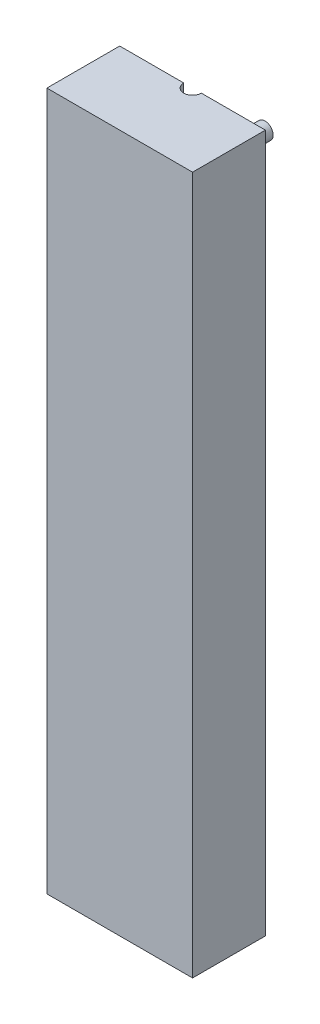
ISO-10303-21;
HEADER;
FILE_DESCRIPTION(('STEP AP214'),'2;1');
FILE_NAME('part.step','',(''),(''),'','','');
FILE_SCHEMA(('AUTOMOTIVE_DESIGN { 1 0 10303 214 1 1 1 1 }'));
ENDSEC;
DATA;
#1=APPLICATION_CONTEXT('core data for automotive mechanical design processes');
#2=APPLICATION_PROTOCOL_DEFINITION('international standard','automotive_design',2000,#1);
#3=PRODUCT_CONTEXT('',#1,'mechanical');
#4=PRODUCT('Part','Part','',(#3));
#5=PRODUCT_RELATED_PRODUCT_CATEGORY('part','',(#4));
#6=PRODUCT_DEFINITION_FORMATION('','',#4);
#7=PRODUCT_DEFINITION_CONTEXT('part definition',#1,'design');
#8=PRODUCT_DEFINITION('design','',#6,#7);
#9=PRODUCT_DEFINITION_SHAPE('','',#8);
#10=(LENGTH_UNIT() NAMED_UNIT(*) SI_UNIT(.MILLI.,.METRE.));
#11=(NAMED_UNIT(*) PLANE_ANGLE_UNIT() SI_UNIT($,.RADIAN.));
#12=(NAMED_UNIT(*) SI_UNIT($,.STERADIAN.) SOLID_ANGLE_UNIT());
#13=UNCERTAINTY_MEASURE_WITH_UNIT(LENGTH_MEASURE(1.E-05),#10,'distance_accuracy_value','');
#14=(GEOMETRIC_REPRESENTATION_CONTEXT(3) GLOBAL_UNCERTAINTY_ASSIGNED_CONTEXT((#13)) GLOBAL_UNIT_ASSIGNED_CONTEXT((#10,
#11,#12)) REPRESENTATION_CONTEXT('',''));
#15=CARTESIAN_POINT('',(0.,0.,0.));
#16=DIRECTION('',(0.,0.,1.));
#17=DIRECTION('',(1.,0.,0.));
#18=AXIS2_PLACEMENT_3D('',#15,#16,#17);
#19=CARTESIAN_POINT('',(0.,0.,0.));
#20=DIRECTION('',(0.,1.,0.));
#21=DIRECTION('',(0.,0.,1.));
#22=AXIS2_PLACEMENT_3D('',#19,#20,#21);
#23=CYLINDRICAL_SURFACE('',#22,12.5);
#24=CARTESIAN_POINT('',(0.,123.,0.));
#25=DIRECTION('',(0.,-1.,0.));
#26=DIRECTION('',(0.,0.,-1.));
#27=AXIS2_PLACEMENT_3D('',#24,#25,#26);
#28=CIRCLE('',#27,12.5);
#29=CARTESIAN_POINT('',(12.5,123.,0.));
#30=VERTEX_POINT('',#29);
#31=CARTESIAN_POINT('',(-12.5,123.,0.));
#32=VERTEX_POINT('',#31);
#33=EDGE_CURVE('E187',#30,#32,#28,.T.);
#34=ORIENTED_EDGE('',*,*,#33,.T.);
#35=DIRECTION('',(0.,-1.,0.));
#36=VECTOR('',#35,1.);
#37=CARTESIAN_POINT('',(-12.5,150.5,0.));
#38=LINE('',#37,#36);
#39=CARTESIAN_POINT('',(-12.5,142.5,0.));
#40=VERTEX_POINT('',#39);
#41=EDGE_CURVE('E56',#32,#40,#38,.F.);
#42=ORIENTED_EDGE('',*,*,#41,.T.);
#43=CARTESIAN_POINT('',(0.,142.5,0.));
#44=DIRECTION('',(0.,1.,0.));
#45=DIRECTION('',(0.,0.,1.));
#46=AXIS2_PLACEMENT_3D('',#43,#44,#45);
#47=CIRCLE('',#46,12.5);
#48=CARTESIAN_POINT('',(12.5,142.5,0.));
#49=VERTEX_POINT('',#48);
#50=EDGE_CURVE('E67',#40,#49,#47,.T.);
#51=ORIENTED_EDGE('',*,*,#50,.T.);
#52=DIRECTION('',(0.,-1.,0.));
#53=VECTOR('',#52,1.);
#54=CARTESIAN_POINT('',(12.5,150.5,0.));
#55=LINE('',#54,#53);
#56=EDGE_CURVE('E11',#49,#30,#55,.T.);
#57=ORIENTED_EDGE('',*,*,#56,.T.);
#58=EDGE_LOOP('',(#34,#42,#51,#57));
#59=FACE_BOUND('',#58,.T.);
#60=ADVANCED_FACE('F47',(#59),#23,.F.);
#61=CARTESIAN_POINT('',(0.,150.5,0.));
#62=DIRECTION('',(0.,1.,0.));
#63=DIRECTION('',(0.,0.,1.));
#64=AXIS2_PLACEMENT_3D('',#61,#62,#63);
#65=PLANE('',#64);
#66=DIRECTION('',(-1.,0.,0.));
#67=VECTOR('',#66,1.);
#68=CARTESIAN_POINT('',(-13.5,150.5,0.));
#69=LINE('',#68,#67);
#70=CARTESIAN_POINT('',(15.5,150.5,0.));
#71=VERTEX_POINT('',#70);
#72=CARTESIAN_POINT('',(1.875,150.5,0.));
#73=VERTEX_POINT('',#72);
#74=EDGE_CURVE('E138',#71,#73,#69,.T.);
#75=ORIENTED_EDGE('',*,*,#74,.T.);
#76=CARTESIAN_POINT('',(0.,150.5,0.));
#77=DIRECTION('',(0.,-1.,0.));
#78=DIRECTION('',(0.,0.,1.));
#79=AXIS2_PLACEMENT_3D('',#76,#77,#78);
#80=CIRCLE('',#79,1.875);
#81=CARTESIAN_POINT('',(-1.875,150.5,0.));
#82=VERTEX_POINT('',#81);
#83=EDGE_CURVE('E207',#73,#82,#80,.T.);
#84=ORIENTED_EDGE('',*,*,#83,.T.);
#85=CARTESIAN_POINT('',(-15.5,150.5,0.));
#86=VERTEX_POINT('',#85);
#87=EDGE_CURVE('E232',#82,#86,#69,.T.);
#88=ORIENTED_EDGE('',*,*,#87,.T.);
#89=DIRECTION('',(0.,0.,1.));
#90=VECTOR('',#89,1.);
#91=CARTESIAN_POINT('',(-15.5,150.5,0.));
#92=LINE('',#91,#90);
#93=CARTESIAN_POINT('',(-15.5,150.5,15.5));
#94=VERTEX_POINT('',#93);
#95=EDGE_CURVE('E145',#86,#94,#92,.T.);
#96=ORIENTED_EDGE('',*,*,#95,.T.);
#97=DIRECTION('',(1.,0.,0.));
#98=VECTOR('',#97,1.);
#99=CARTESIAN_POINT('',(-15.5,150.5,15.5));
#100=LINE('',#99,#98);
#101=CARTESIAN_POINT('',(15.5,150.5,15.5));
#102=VERTEX_POINT('',#101);
#103=EDGE_CURVE('E162',#94,#102,#100,.T.);
#104=ORIENTED_EDGE('',*,*,#103,.T.);
#105=DIRECTION('',(0.,0.,-1.));
#106=VECTOR('',#105,1.);
#107=CARTESIAN_POINT('',(15.5,150.5,15.5));
#108=LINE('',#107,#106);
#109=EDGE_CURVE('E156',#102,#71,#108,.T.);
#110=ORIENTED_EDGE('',*,*,#109,.T.);
#111=EDGE_LOOP('',(#75,#84,#88,#96,#104,#110));
#112=FACE_BOUND('',#111,.T.);
#113=ADVANCED_FACE('F49',(#112),#65,.T.);
#114=CARTESIAN_POINT('',(-13.5,2.,0.));
#115=DIRECTION('',(0.,0.,-1.));
#116=DIRECTION('',(-1.,0.,0.));
#117=AXIS2_PLACEMENT_3D('',#114,#115,#116);
#118=PLANE('',#117);
#119=CARTESIAN_POINT('',(12.,5.5,0.));
#120=DIRECTION('',(0.,0.,-1.));
#121=DIRECTION('',(-1.,0.,0.));
#122=AXIS2_PLACEMENT_3D('',#119,#120,#121);
#123=CIRCLE('',#122,1.75);
#124=CARTESIAN_POINT('',(10.25,5.5,0.));
#125=VERTEX_POINT('',#124);
#126=EDGE_CURVE('E291',#125,#125,#123,.T.);
#127=ORIENTED_EDGE('',*,*,#126,.F.);
#128=EDGE_LOOP('',(#127));
#129=FACE_BOUND('',#128,.T.);
#130=CARTESIAN_POINT('',(12.,147.,0.));
#131=DIRECTION('',(0.,0.,-1.));
#132=DIRECTION('',(-1.,0.,0.));
#133=AXIS2_PLACEMENT_3D('',#130,#131,#132);
#134=CIRCLE('',#133,1.75);
#135=CARTESIAN_POINT('',(10.25,147.,0.));
#136=VERTEX_POINT('',#135);
#137=EDGE_CURVE('E294',#136,#136,#134,.T.);
#138=ORIENTED_EDGE('',*,*,#137,.F.);
#139=EDGE_LOOP('',(#138));
#140=FACE_BOUND('',#139,.T.);
#141=ORIENTED_EDGE('',*,*,#56,.F.);
#142=DIRECTION('',(-1.,0.,0.));
#143=VECTOR('',#142,1.);
#144=CARTESIAN_POINT('',(12.5,142.5,0.));
#145=LINE('',#144,#143);
#146=CARTESIAN_POINT('',(1.875,142.5,0.));
#147=VERTEX_POINT('',#146);
#148=EDGE_CURVE('E212',#49,#147,#145,.T.);
#149=ORIENTED_EDGE('',*,*,#148,.T.);
#150=DIRECTION('',(0.,1.,0.));
#151=VECTOR('',#150,1.);
#152=CARTESIAN_POINT('',(1.875,142.5,0.));
#153=LINE('',#152,#151);
#154=EDGE_CURVE('E224',#147,#73,#153,.T.);
#155=ORIENTED_EDGE('',*,*,#154,.T.);
#156=ORIENTED_EDGE('',*,*,#74,.F.);
#157=DIRECTION('',(0.,1.,0.));
#158=VECTOR('',#157,1.);
#159=CARTESIAN_POINT('',(15.5,2.,0.));
#160=LINE('',#159,#158);
#161=CARTESIAN_POINT('',(15.5,2.,0.));
#162=VERTEX_POINT('',#161);
#163=EDGE_CURVE('E177',#162,#71,#160,.T.);
#164=ORIENTED_EDGE('',*,*,#163,.F.);
#165=DIRECTION('',(-1.,0.,0.));
#166=VECTOR('',#165,1.);
#167=CARTESIAN_POINT('',(-13.5,2.,0.));
#168=LINE('',#167,#166);
#169=CARTESIAN_POINT('',(8.,2.,0.));
#170=VERTEX_POINT('',#169);
#171=EDGE_CURVE('E137',#162,#170,#168,.T.);
#172=ORIENTED_EDGE('',*,*,#171,.T.);
#173=DIRECTION('',(0.,-1.,0.));
#174=VECTOR('',#173,1.);
#175=CARTESIAN_POINT('',(8.,123.,0.));
#176=LINE('',#175,#174);
#177=CARTESIAN_POINT('',(8.,123.,0.));
#178=VERTEX_POINT('',#177);
#179=EDGE_CURVE('E203',#178,#170,#176,.T.);
#180=ORIENTED_EDGE('',*,*,#179,.F.);
#181=DIRECTION('',(1.,0.,0.));
#182=VECTOR('',#181,1.);
#183=CARTESIAN_POINT('',(8.,123.,0.));
#184=LINE('',#183,#182);
#185=EDGE_CURVE('E197',#178,#30,#184,.T.);
#186=ORIENTED_EDGE('',*,*,#185,.T.);
#187=EDGE_LOOP('',(#141,#149,#155,#156,#164,#172,#180,#186));
#188=FACE_BOUND('',#187,.T.);
#189=ADVANCED_FACE('F254',(#129,#140,#188),#118,.T.);
#190=CARTESIAN_POINT('',(-12.,5.5,0.));
#191=DIRECTION('',(0.,0.,-1.));
#192=DIRECTION('',(-1.,0.,0.));
#193=AXIS2_PLACEMENT_3D('',#190,#191,#192);
#194=CIRCLE('',#193,1.75);
#195=CARTESIAN_POINT('',(-13.75,5.5,0.));
#196=VERTEX_POINT('',#195);
#197=EDGE_CURVE('E354',#196,#196,#194,.T.);
#198=ORIENTED_EDGE('',*,*,#197,.F.);
#199=EDGE_LOOP('',(#198));
#200=FACE_BOUND('',#199,.T.);
#201=CARTESIAN_POINT('',(-12.,147.,0.));
#202=DIRECTION('',(0.,0.,-1.));
#203=DIRECTION('',(-1.,0.,0.));
#204=AXIS2_PLACEMENT_3D('',#201,#202,#203);
#205=CIRCLE('',#204,1.75);
#206=CARTESIAN_POINT('',(-13.75,147.,0.));
#207=VERTEX_POINT('',#206);
#208=EDGE_CURVE('E165',#207,#207,#205,.T.);
#209=ORIENTED_EDGE('',*,*,#208,.F.);
#210=EDGE_LOOP('',(#209));
#211=FACE_BOUND('',#210,.T.);
#212=ORIENTED_EDGE('',*,*,#41,.F.);
#213=DIRECTION('',(1.,0.,0.));
#214=VECTOR('',#213,1.);
#215=CARTESIAN_POINT('',(-12.5,123.,0.));
#216=LINE('',#215,#214);
#217=CARTESIAN_POINT('',(-8.,123.,0.));
#218=VERTEX_POINT('',#217);
#219=EDGE_CURVE('E190',#32,#218,#216,.T.);
#220=ORIENTED_EDGE('',*,*,#219,.T.);
#221=DIRECTION('',(0.,-1.,0.));
#222=VECTOR('',#221,1.);
#223=CARTESIAN_POINT('',(-8.,123.,0.));
#224=LINE('',#223,#222);
#225=CARTESIAN_POINT('',(-8.,2.,0.));
#226=VERTEX_POINT('',#225);
#227=EDGE_CURVE('E131',#218,#226,#224,.T.);
#228=ORIENTED_EDGE('',*,*,#227,.T.);
#229=CARTESIAN_POINT('',(-15.5,2.,0.));
#230=VERTEX_POINT('',#229);
#231=EDGE_CURVE('E125',#226,#230,#168,.T.);
#232=ORIENTED_EDGE('',*,*,#231,.T.);
#233=DIRECTION('',(0.,1.,0.));
#234=VECTOR('',#233,1.);
#235=CARTESIAN_POINT('',(-15.5,2.,0.));
#236=LINE('',#235,#234);
#237=EDGE_CURVE('E128',#230,#86,#236,.T.);
#238=ORIENTED_EDGE('',*,*,#237,.T.);
#239=ORIENTED_EDGE('',*,*,#87,.F.);
#240=DIRECTION('',(0.,1.,0.));
#241=VECTOR('',#240,1.);
#242=CARTESIAN_POINT('',(-1.875,142.5,0.));
#243=LINE('',#242,#241);
#244=CARTESIAN_POINT('',(-1.875,142.5,0.));
#245=VERTEX_POINT('',#244);
#246=EDGE_CURVE('E228',#245,#82,#243,.T.);
#247=ORIENTED_EDGE('',*,*,#246,.F.);
#248=DIRECTION('',(-1.,0.,0.));
#249=VECTOR('',#248,1.);
#250=CARTESIAN_POINT('',(-1.875,142.5,0.));
#251=LINE('',#250,#249);
#252=EDGE_CURVE('E220',#245,#40,#251,.T.);
#253=ORIENTED_EDGE('',*,*,#252,.T.);
#254=EDGE_LOOP('',(#212,#220,#228,#232,#238,#239,#247,#253));
#255=FACE_BOUND('',#254,.T.);
#256=ADVANCED_FACE('F127',(#200,#211,#255),#118,.T.);
#257=CARTESIAN_POINT('',(0.,2.,0.));
#258=DIRECTION('',(0.,1.,0.));
#259=DIRECTION('',(0.,0.,1.));
#260=AXIS2_PLACEMENT_3D('',#257,#258,#259);
#261=PLANE('',#260);
#262=ORIENTED_EDGE('',*,*,#231,.F.);
#263=CARTESIAN_POINT('',(0.,2.,0.));
#264=DIRECTION('',(0.,1.,0.));
#265=DIRECTION('',(0.,0.,-1.));
#266=AXIS2_PLACEMENT_3D('',#263,#264,#265);
#267=CIRCLE('',#266,8.);
#268=EDGE_CURVE('E181',#226,#170,#267,.T.);
#269=ORIENTED_EDGE('',*,*,#268,.T.);
#270=ORIENTED_EDGE('',*,*,#171,.F.);
#271=DIRECTION('',(0.,0.,-1.));
#272=VECTOR('',#271,1.);
#273=CARTESIAN_POINT('',(15.5,2.,15.5));
#274=LINE('',#273,#272);
#275=CARTESIAN_POINT('',(15.5,2.,15.5));
#276=VERTEX_POINT('',#275);
#277=EDGE_CURVE('E148',#276,#162,#274,.T.);
#278=ORIENTED_EDGE('',*,*,#277,.F.);
#279=DIRECTION('',(1.,0.,0.));
#280=VECTOR('',#279,1.);
#281=CARTESIAN_POINT('',(-15.5,2.,15.5));
#282=LINE('',#281,#280);
#283=CARTESIAN_POINT('',(-15.5,2.,15.5));
#284=VERTEX_POINT('',#283);
#285=EDGE_CURVE('E154',#284,#276,#282,.T.);
#286=ORIENTED_EDGE('',*,*,#285,.F.);
#287=DIRECTION('',(0.,0.,1.));
#288=VECTOR('',#287,1.);
#289=CARTESIAN_POINT('',(-15.5,2.,0.));
#290=LINE('',#289,#288);
#291=EDGE_CURVE('E143',#230,#284,#290,.T.);
#292=ORIENTED_EDGE('',*,*,#291,.F.);
#293=EDGE_LOOP('',(#262,#269,#270,#278,#286,#292));
#294=FACE_BOUND('',#293,.T.);
#295=ADVANCED_FACE('F151',(#294),#261,.F.);
#296=CARTESIAN_POINT('',(0.,142.5,0.));
#297=DIRECTION('',(0.,1.,0.));
#298=DIRECTION('',(0.,0.,1.));
#299=AXIS2_PLACEMENT_3D('',#296,#297,#298);
#300=CYLINDRICAL_SURFACE('',#299,1.875);
#301=ORIENTED_EDGE('',*,*,#83,.F.);
#302=ORIENTED_EDGE('',*,*,#154,.F.);
#303=CARTESIAN_POINT('',(0.,142.5,0.));
#304=DIRECTION('',(0.,-1.,0.));
#305=DIRECTION('',(0.,0.,1.));
#306=AXIS2_PLACEMENT_3D('',#303,#304,#305);
#307=CIRCLE('',#306,1.875);
#308=EDGE_CURVE('E216',#147,#245,#307,.T.);
#309=ORIENTED_EDGE('',*,*,#308,.T.);
#310=ORIENTED_EDGE('',*,*,#246,.T.);
#311=EDGE_LOOP('',(#301,#302,#309,#310));
#312=FACE_BOUND('',#311,.T.);
#313=ADVANCED_FACE('F243',(#312),#300,.F.);
#314=CARTESIAN_POINT('',(0.,142.5,0.));
#315=DIRECTION('',(0.,1.,0.));
#316=DIRECTION('',(0.,0.,1.));
#317=AXIS2_PLACEMENT_3D('',#314,#315,#316);
#318=PLANE('',#317);
#319=ORIENTED_EDGE('',*,*,#50,.F.);
#320=ORIENTED_EDGE('',*,*,#252,.F.);
#321=ORIENTED_EDGE('',*,*,#308,.F.);
#322=ORIENTED_EDGE('',*,*,#148,.F.);
#323=EDGE_LOOP('',(#319,#320,#321,#322));
#324=FACE_BOUND('',#323,.T.);
#325=ADVANCED_FACE('F248',(#324),#318,.F.);
#326=CARTESIAN_POINT('',(0.,123.,0.));
#327=DIRECTION('',(0.,-1.,0.));
#328=DIRECTION('',(0.,0.,-1.));
#329=AXIS2_PLACEMENT_3D('',#326,#327,#328);
#330=CYLINDRICAL_SURFACE('',#329,8.);
#331=ORIENTED_EDGE('',*,*,#268,.F.);
#332=ORIENTED_EDGE('',*,*,#227,.F.);
#333=CARTESIAN_POINT('',(0.,123.,0.));
#334=DIRECTION('',(0.,1.,0.));
#335=DIRECTION('',(0.,0.,-1.));
#336=AXIS2_PLACEMENT_3D('',#333,#334,#335);
#337=CIRCLE('',#336,8.);
#338=EDGE_CURVE('E193',#218,#178,#337,.T.);
#339=ORIENTED_EDGE('',*,*,#338,.T.);
#340=ORIENTED_EDGE('',*,*,#179,.T.);
#341=EDGE_LOOP('',(#331,#332,#339,#340));
#342=FACE_BOUND('',#341,.T.);
#343=ADVANCED_FACE('F257',(#342),#330,.F.);
#344=CARTESIAN_POINT('',(0.,123.,0.));
#345=DIRECTION('',(0.,-1.,0.));
#346=DIRECTION('',(0.,0.,-1.));
#347=AXIS2_PLACEMENT_3D('',#344,#345,#346);
#348=PLANE('',#347);
#349=ORIENTED_EDGE('',*,*,#33,.F.);
#350=ORIENTED_EDGE('',*,*,#185,.F.);
#351=ORIENTED_EDGE('',*,*,#338,.F.);
#352=ORIENTED_EDGE('',*,*,#219,.F.);
#353=EDGE_LOOP('',(#349,#350,#351,#352));
#354=FACE_BOUND('',#353,.T.);
#355=ADVANCED_FACE('F251',(#354),#348,.F.);
#356=CARTESIAN_POINT('',(15.5,2.,15.5));
#357=DIRECTION('',(1.,0.,0.));
#358=DIRECTION('',(0.,0.,-1.));
#359=AXIS2_PLACEMENT_3D('',#356,#357,#358);
#360=PLANE('',#359);
#361=ORIENTED_EDGE('',*,*,#109,.F.);
#362=DIRECTION('',(0.,1.,0.));
#363=VECTOR('',#362,1.);
#364=CARTESIAN_POINT('',(15.5,2.,15.5));
#365=LINE('',#364,#363);
#366=EDGE_CURVE('E182',#276,#102,#365,.T.);
#367=ORIENTED_EDGE('',*,*,#366,.F.);
#368=ORIENTED_EDGE('',*,*,#277,.T.);
#369=ORIENTED_EDGE('',*,*,#163,.T.);
#370=EDGE_LOOP('',(#361,#367,#368,#369));
#371=FACE_BOUND('',#370,.T.);
#372=ADVANCED_FACE('F260',(#371),#360,.T.);
#373=CARTESIAN_POINT('',(-15.5,2.,15.5));
#374=DIRECTION('',(0.,0.,1.));
#375=DIRECTION('',(1.,0.,0.));
#376=AXIS2_PLACEMENT_3D('',#373,#374,#375);
#377=PLANE('',#376);
#378=ORIENTED_EDGE('',*,*,#103,.F.);
#379=DIRECTION('',(0.,1.,0.));
#380=VECTOR('',#379,1.);
#381=CARTESIAN_POINT('',(-15.5,2.,15.5));
#382=LINE('',#381,#380);
#383=EDGE_CURVE('E147',#284,#94,#382,.T.);
#384=ORIENTED_EDGE('',*,*,#383,.F.);
#385=ORIENTED_EDGE('',*,*,#285,.T.);
#386=ORIENTED_EDGE('',*,*,#366,.T.);
#387=EDGE_LOOP('',(#378,#384,#385,#386));
#388=FACE_BOUND('',#387,.T.);
#389=ADVANCED_FACE('F263',(#388),#377,.T.);
#390=CARTESIAN_POINT('',(-15.5,2.,0.));
#391=DIRECTION('',(-1.,0.,0.));
#392=DIRECTION('',(0.,0.,1.));
#393=AXIS2_PLACEMENT_3D('',#390,#391,#392);
#394=PLANE('',#393);
#395=ORIENTED_EDGE('',*,*,#95,.F.);
#396=ORIENTED_EDGE('',*,*,#237,.F.);
#397=ORIENTED_EDGE('',*,*,#291,.T.);
#398=ORIENTED_EDGE('',*,*,#383,.T.);
#399=EDGE_LOOP('',(#395,#396,#397,#398));
#400=FACE_BOUND('',#399,.T.);
#401=ADVANCED_FACE('F142',(#400),#394,.T.);
#402=CARTESIAN_POINT('',(-12.,147.,3.5));
#403=DIRECTION('',(0.,0.,-1.));
#404=DIRECTION('',(-1.,0.,0.));
#405=AXIS2_PLACEMENT_3D('',#402,#403,#404);
#406=CYLINDRICAL_SURFACE('',#405,1.75);
#407=CARTESIAN_POINT('',(-12.,147.,3.5));
#408=DIRECTION('',(0.,0.,-1.));
#409=DIRECTION('',(-1.,0.,0.));
#410=AXIS2_PLACEMENT_3D('',#407,#408,#409);
#411=CIRCLE('',#410,1.75);
#412=CARTESIAN_POINT('',(-13.75,147.,3.5));
#413=VERTEX_POINT('',#412);
#414=EDGE_CURVE('E173',#413,#413,#411,.T.);
#415=ORIENTED_EDGE('',*,*,#414,.F.);
#416=EDGE_LOOP('',(#415));
#417=FACE_BOUND('',#416,.T.);
#418=ORIENTED_EDGE('',*,*,#208,.T.);
#419=EDGE_LOOP('',(#418));
#420=FACE_BOUND('',#419,.T.);
#421=ADVANCED_FACE('F270',(#417,#420),#406,.F.);
#422=CARTESIAN_POINT('',(-12.,147.,3.5));
#423=DIRECTION('',(0.,0.,-1.));
#424=DIRECTION('',(-1.,0.,0.));
#425=AXIS2_PLACEMENT_3D('',#422,#423,#424);
#426=PLANE('',#425);
#427=ORIENTED_EDGE('',*,*,#414,.T.);
#428=EDGE_LOOP('',(#427));
#429=FACE_BOUND('',#428,.T.);
#430=ADVANCED_FACE('F317',(#429),#426,.T.);
#431=CARTESIAN_POINT('',(12.,147.,-3.4));
#432=DIRECTION('',(0.,0.,1.));
#433=DIRECTION('',(1.,0.,0.));
#434=AXIS2_PLACEMENT_3D('',#431,#432,#433);
#435=CYLINDRICAL_SURFACE('',#434,1.75);
#436=CARTESIAN_POINT('',(12.,147.,-3.4));
#437=DIRECTION('',(0.,0.,-1.));
#438=DIRECTION('',(-1.,0.,0.));
#439=AXIS2_PLACEMENT_3D('',#436,#437,#438);
#440=CIRCLE('',#439,1.75);
#441=CARTESIAN_POINT('',(10.25,147.,-3.4));
#442=VERTEX_POINT('',#441);
#443=EDGE_CURVE('E297',#442,#442,#440,.T.);
#444=ORIENTED_EDGE('',*,*,#443,.F.);
#445=EDGE_LOOP('',(#444));
#446=FACE_BOUND('',#445,.T.);
#447=ORIENTED_EDGE('',*,*,#137,.T.);
#448=EDGE_LOOP('',(#447));
#449=FACE_BOUND('',#448,.T.);
#450=ADVANCED_FACE('F323',(#446,#449),#435,.T.);
#451=CARTESIAN_POINT('',(12.,147.,-3.4));
#452=DIRECTION('',(0.,0.,-1.));
#453=DIRECTION('',(-1.,0.,0.));
#454=AXIS2_PLACEMENT_3D('',#451,#452,#453);
#455=PLANE('',#454);
#456=ORIENTED_EDGE('',*,*,#443,.T.);
#457=EDGE_LOOP('',(#456));
#458=FACE_BOUND('',#457,.T.);
#459=ADVANCED_FACE('F328',(#458),#455,.T.);
#460=CARTESIAN_POINT('',(12.,5.5,3.5));
#461=DIRECTION('',(0.,0.,-1.));
#462=DIRECTION('',(-1.,0.,0.));
#463=AXIS2_PLACEMENT_3D('',#460,#461,#462);
#464=CYLINDRICAL_SURFACE('',#463,1.75);
#465=CARTESIAN_POINT('',(12.,5.5,3.5));
#466=DIRECTION('',(0.,0.,-1.));
#467=DIRECTION('',(-1.,0.,0.));
#468=AXIS2_PLACEMENT_3D('',#465,#466,#467);
#469=CIRCLE('',#468,1.75);
#470=CARTESIAN_POINT('',(10.25,5.5,3.5));
#471=VERTEX_POINT('',#470);
#472=EDGE_CURVE('E298',#471,#471,#469,.T.);
#473=ORIENTED_EDGE('',*,*,#472,.F.);
#474=EDGE_LOOP('',(#473));
#475=FACE_BOUND('',#474,.T.);
#476=ORIENTED_EDGE('',*,*,#126,.T.);
#477=EDGE_LOOP('',(#476));
#478=FACE_BOUND('',#477,.T.);
#479=ADVANCED_FACE('F332',(#475,#478),#464,.F.);
#480=CARTESIAN_POINT('',(12.,5.5,3.5));
#481=DIRECTION('',(0.,0.,-1.));
#482=DIRECTION('',(-1.,0.,0.));
#483=AXIS2_PLACEMENT_3D('',#480,#481,#482);
#484=PLANE('',#483);
#485=ORIENTED_EDGE('',*,*,#472,.T.);
#486=EDGE_LOOP('',(#485));
#487=FACE_BOUND('',#486,.T.);
#488=ADVANCED_FACE('F336',(#487),#484,.T.);
#489=CARTESIAN_POINT('',(-12.,5.5,-3.4));
#490=DIRECTION('',(0.,0.,1.));
#491=DIRECTION('',(1.,0.,0.));
#492=AXIS2_PLACEMENT_3D('',#489,#490,#491);
#493=CYLINDRICAL_SURFACE('',#492,1.75);
#494=CARTESIAN_POINT('',(-12.,5.5,-3.4));
#495=DIRECTION('',(0.,0.,-1.));
#496=DIRECTION('',(-1.,0.,0.));
#497=AXIS2_PLACEMENT_3D('',#494,#495,#496);
#498=CIRCLE('',#497,1.75);
#499=CARTESIAN_POINT('',(-13.75,5.5,-3.4));
#500=VERTEX_POINT('',#499);
#501=EDGE_CURVE('E352',#500,#500,#498,.T.);
#502=ORIENTED_EDGE('',*,*,#501,.F.);
#503=EDGE_LOOP('',(#502));
#504=FACE_BOUND('',#503,.T.);
#505=ORIENTED_EDGE('',*,*,#197,.T.);
#506=EDGE_LOOP('',(#505));
#507=FACE_BOUND('',#506,.T.);
#508=ADVANCED_FACE('F340',(#504,#507),#493,.T.);
#509=CARTESIAN_POINT('',(-12.,5.5,-3.4));
#510=DIRECTION('',(0.,0.,-1.));
#511=DIRECTION('',(-1.,0.,0.));
#512=AXIS2_PLACEMENT_3D('',#509,#510,#511);
#513=PLANE('',#512);
#514=ORIENTED_EDGE('',*,*,#501,.T.);
#515=EDGE_LOOP('',(#514));
#516=FACE_BOUND('',#515,.T.);
#517=ADVANCED_FACE('F344',(#516),#513,.T.);
#518=CLOSED_SHELL('',(#60,#113,#189,#256,#295,#313,#325,#343,#355,#372,#389,#401,#421,#430,#450,
#459,#479,#488,#508,#517));
#519=MANIFOLD_SOLID_BREP('B2',#518);
#520=ADVANCED_BREP_SHAPE_REPRESENTATION('',(#18,#519),#14);
#521=SHAPE_DEFINITION_REPRESENTATION(#9,#520);
ENDSEC;
END-ISO-10303-21;
